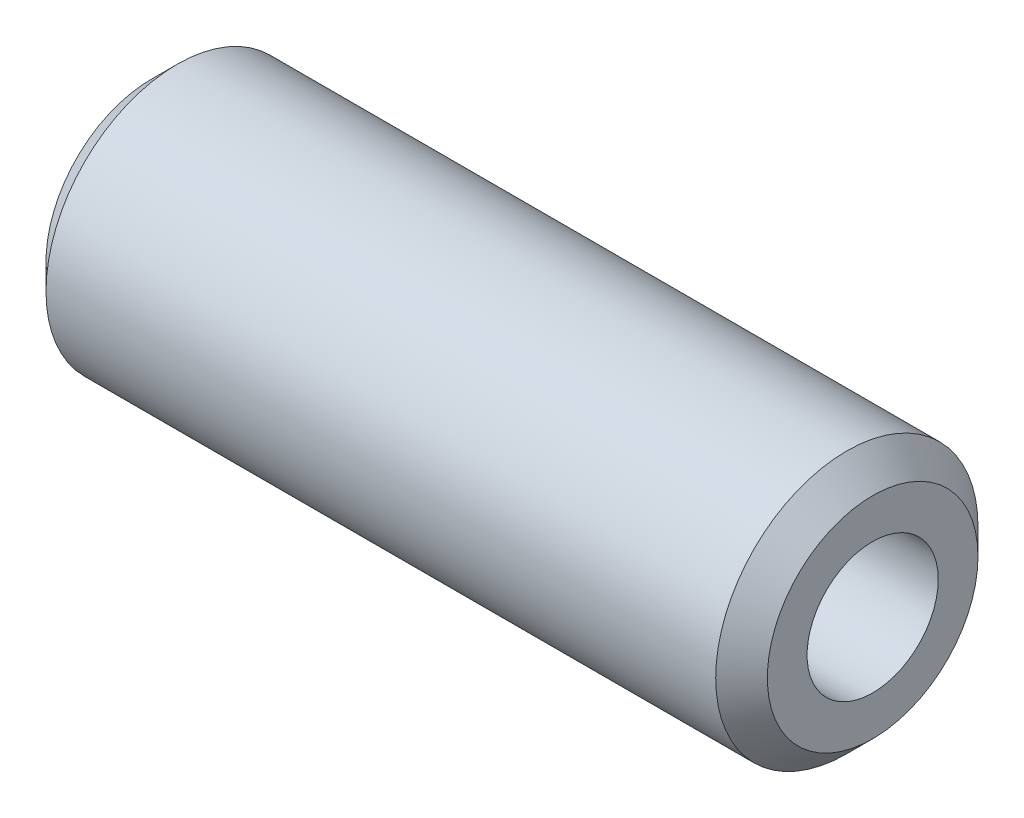
ISO-10303-21;
HEADER;
FILE_DESCRIPTION(('STEP AP214'),'2;1');
FILE_NAME('part.step','',(''),(''),'','','');
FILE_SCHEMA(('AUTOMOTIVE_DESIGN { 1 0 10303 214 1 1 1 1 }'));
ENDSEC;
DATA;
#1=APPLICATION_CONTEXT('core data for automotive mechanical design processes');
#2=APPLICATION_PROTOCOL_DEFINITION('international standard','automotive_design',2000,#1);
#3=PRODUCT_CONTEXT('',#1,'mechanical');
#4=PRODUCT('Part','Part','',(#3));
#5=PRODUCT_RELATED_PRODUCT_CATEGORY('part','',(#4));
#6=PRODUCT_DEFINITION_FORMATION('','',#4);
#7=PRODUCT_DEFINITION_CONTEXT('part definition',#1,'design');
#8=PRODUCT_DEFINITION('design','',#6,#7);
#9=PRODUCT_DEFINITION_SHAPE('','',#8);
#10=(LENGTH_UNIT() NAMED_UNIT(*) SI_UNIT(.MILLI.,.METRE.));
#11=(NAMED_UNIT(*) PLANE_ANGLE_UNIT() SI_UNIT($,.RADIAN.));
#12=(NAMED_UNIT(*) SI_UNIT($,.STERADIAN.) SOLID_ANGLE_UNIT());
#13=UNCERTAINTY_MEASURE_WITH_UNIT(LENGTH_MEASURE(1.E-05),#10,'distance_accuracy_value','');
#14=(GEOMETRIC_REPRESENTATION_CONTEXT(3) GLOBAL_UNCERTAINTY_ASSIGNED_CONTEXT((#13)) GLOBAL_UNIT_ASSIGNED_CONTEXT((#10,
#11,#12)) REPRESENTATION_CONTEXT('',''));
#15=CARTESIAN_POINT('',(0.,0.,0.));
#16=DIRECTION('',(0.,0.,1.));
#17=DIRECTION('',(1.,0.,0.));
#18=AXIS2_PLACEMENT_3D('',#15,#16,#17);
#19=CARTESIAN_POINT('',(34.925,0.,0.));
#20=DIRECTION('',(1.,0.,0.));
#21=DIRECTION('',(0.,0.,-1.));
#22=AXIS2_PLACEMENT_3D('',#19,#20,#21);
#23=PLANE('',#22);
#24=CARTESIAN_POINT('',(34.925,0.,0.));
#25=DIRECTION('',(1.,0.,0.));
#26=DIRECTION('',(0.,0.,-1.));
#27=AXIS2_PLACEMENT_3D('',#24,#25,#26);
#28=CIRCLE('',#27,10.2);
#29=CARTESIAN_POINT('',(34.925,0.,-10.2));
#30=VERTEX_POINT('',#29);
#31=EDGE_CURVE('E64',#30,#30,#28,.T.);
#32=ORIENTED_EDGE('',*,*,#31,.T.);
#33=EDGE_LOOP('',(#32));
#34=FACE_BOUND('',#33,.T.);
#35=CARTESIAN_POINT('',(34.925,0.,0.));
#36=DIRECTION('',(1.,0.,0.));
#37=DIRECTION('',(0.,0.,-1.));
#38=AXIS2_PLACEMENT_3D('',#35,#36,#37);
#39=CIRCLE('',#38,6.35);
#40=CARTESIAN_POINT('',(34.925,0.,-6.35));
#41=VERTEX_POINT('',#40);
#42=EDGE_CURVE('E70',#41,#41,#39,.T.);
#43=ORIENTED_EDGE('',*,*,#42,.F.);
#44=EDGE_LOOP('',(#43));
#45=FACE_BOUND('',#44,.T.);
#46=ADVANCED_FACE('F45',(#34,#45),#23,.T.);
#47=CARTESIAN_POINT('',(-34.925,0.,0.));
#48=DIRECTION('',(1.,0.,0.));
#49=DIRECTION('',(0.,0.,-1.));
#50=AXIS2_PLACEMENT_3D('',#47,#48,#49);
#51=PLANE('',#50);
#52=CARTESIAN_POINT('',(-34.925,0.,0.));
#53=DIRECTION('',(1.,0.,0.));
#54=DIRECTION('',(0.,0.,-1.));
#55=AXIS2_PLACEMENT_3D('',#52,#53,#54);
#56=CIRCLE('',#55,10.2);
#57=CARTESIAN_POINT('',(-34.925,0.,-10.2));
#58=VERTEX_POINT('',#57);
#59=EDGE_CURVE('E10',#58,#58,#56,.F.);
#60=ORIENTED_EDGE('',*,*,#59,.T.);
#61=EDGE_LOOP('',(#60));
#62=FACE_BOUND('',#61,.T.);
#63=CARTESIAN_POINT('',(-34.925,0.,0.));
#64=DIRECTION('',(1.,0.,0.));
#65=DIRECTION('',(0.,0.,-1.));
#66=AXIS2_PLACEMENT_3D('',#63,#64,#65);
#67=CIRCLE('',#66,6.35);
#68=CARTESIAN_POINT('',(-34.925,0.,-6.35));
#69=VERTEX_POINT('',#68);
#70=EDGE_CURVE('E71',#69,#69,#67,.T.);
#71=ORIENTED_EDGE('',*,*,#70,.T.);
#72=EDGE_LOOP('',(#71));
#73=FACE_BOUND('',#72,.T.);
#74=ADVANCED_FACE('F83',(#62,#73),#51,.F.);
#75=CARTESIAN_POINT('',(34.925,0.,0.));
#76=DIRECTION('',(-1.,0.,0.));
#77=DIRECTION('',(0.,0.,1.));
#78=AXIS2_PLACEMENT_3D('',#75,#76,#77);
#79=CYLINDRICAL_SURFACE('',#78,12.7);
#80=CARTESIAN_POINT('',(32.425,0.,0.));
#81=DIRECTION('',(1.,0.,0.));
#82=DIRECTION('',(0.,0.,-1.));
#83=AXIS2_PLACEMENT_3D('',#80,#81,#82);
#84=CIRCLE('',#83,12.7);
#85=CARTESIAN_POINT('',(32.425,0.,-12.7));
#86=VERTEX_POINT('',#85);
#87=EDGE_CURVE('E54',#86,#86,#84,.F.);
#88=ORIENTED_EDGE('',*,*,#87,.T.);
#89=EDGE_LOOP('',(#88));
#90=FACE_BOUND('',#89,.T.);
#91=CARTESIAN_POINT('',(-32.425,0.,0.));
#92=DIRECTION('',(1.,0.,0.));
#93=DIRECTION('',(0.,0.,-1.));
#94=AXIS2_PLACEMENT_3D('',#91,#92,#93);
#95=CIRCLE('',#94,12.7);
#96=CARTESIAN_POINT('',(-32.425,0.,-12.7));
#97=VERTEX_POINT('',#96);
#98=EDGE_CURVE('E59',#97,#97,#95,.T.);
#99=ORIENTED_EDGE('',*,*,#98,.T.);
#100=EDGE_LOOP('',(#99));
#101=FACE_BOUND('',#100,.T.);
#102=ADVANCED_FACE('F90',(#90,#101),#79,.T.);
#103=CARTESIAN_POINT('',(34.925,0.,0.));
#104=DIRECTION('',(-1.,0.,0.));
#105=DIRECTION('',(0.,0.,1.));
#106=AXIS2_PLACEMENT_3D('',#103,#104,#105);
#107=CYLINDRICAL_SURFACE('',#106,6.35);
#108=ORIENTED_EDGE('',*,*,#42,.T.);
#109=EDGE_LOOP('',(#108));
#110=FACE_BOUND('',#109,.T.);
#111=ORIENTED_EDGE('',*,*,#70,.F.);
#112=EDGE_LOOP('',(#111));
#113=FACE_BOUND('',#112,.T.);
#114=ADVANCED_FACE('F79',(#110,#113),#107,.F.);
#115=CARTESIAN_POINT('',(34.925,0.,0.));
#116=DIRECTION('',(-1.,0.,0.));
#117=DIRECTION('',(0.,0.,1.));
#118=AXIS2_PLACEMENT_3D('',#115,#116,#117);
#119=CONICAL_SURFACE('',#118,10.2,0.785398163397446);
#120=ORIENTED_EDGE('',*,*,#87,.F.);
#121=EDGE_LOOP('',(#120));
#122=FACE_BOUND('',#121,.T.);
#123=ORIENTED_EDGE('',*,*,#31,.F.);
#124=EDGE_LOOP('',(#123));
#125=FACE_BOUND('',#124,.T.);
#126=ADVANCED_FACE('F96',(#122,#125),#119,.T.);
#127=CARTESIAN_POINT('',(-32.425,0.,0.));
#128=DIRECTION('',(1.,0.,0.));
#129=DIRECTION('',(0.,0.,-1.));
#130=AXIS2_PLACEMENT_3D('',#127,#128,#129);
#131=CONICAL_SURFACE('',#130,12.7,0.785398163397449);
#132=ORIENTED_EDGE('',*,*,#59,.F.);
#133=EDGE_LOOP('',(#132));
#134=FACE_BOUND('',#133,.T.);
#135=ORIENTED_EDGE('',*,*,#98,.F.);
#136=EDGE_LOOP('',(#135));
#137=FACE_BOUND('',#136,.T.);
#138=ADVANCED_FACE('F48',(#134,#137),#131,.T.);
#139=CLOSED_SHELL('',(#46,#74,#102,#114,#126,#138));
#140=MANIFOLD_SOLID_BREP('B2',#139);
#141=ADVANCED_BREP_SHAPE_REPRESENTATION('',(#18,#140),#14);
#142=SHAPE_DEFINITION_REPRESENTATION(#9,#141);
ENDSEC;
END-ISO-10303-21;
